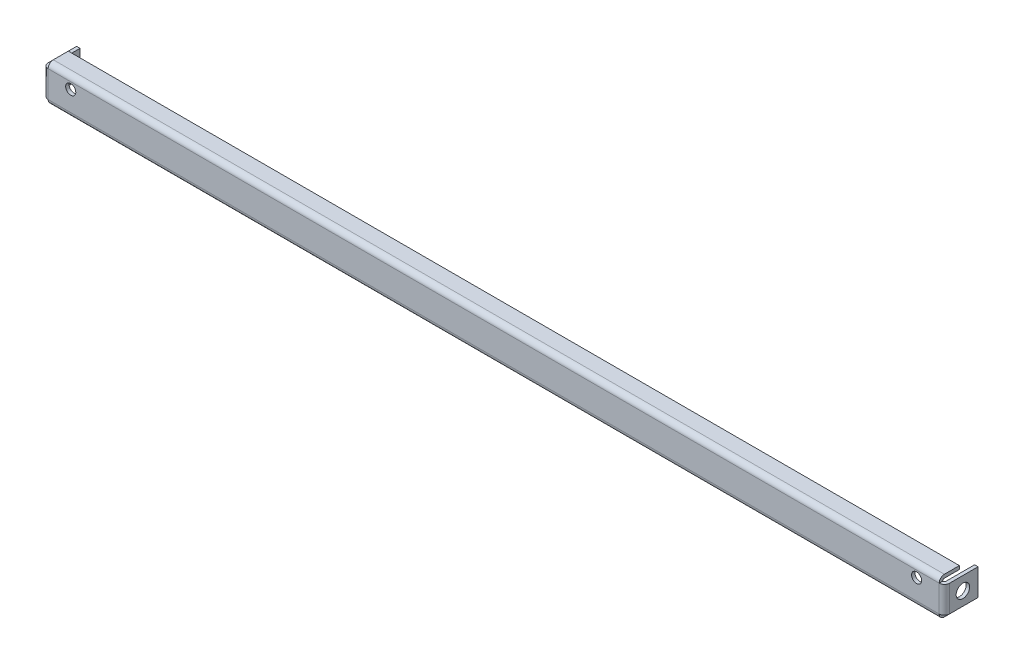
ISO-10303-21;
HEADER;
FILE_DESCRIPTION(('STEP AP214'),'2;1');
FILE_NAME('part.step','',(''),(''),'','','');
FILE_SCHEMA(('AUTOMOTIVE_DESIGN { 1 0 10303 214 1 1 1 1 }'));
ENDSEC;
DATA;
#1=APPLICATION_CONTEXT('core data for automotive mechanical design processes');
#2=APPLICATION_PROTOCOL_DEFINITION('international standard','automotive_design',2000,#1);
#3=PRODUCT_CONTEXT('',#1,'mechanical');
#4=PRODUCT('Part','Part','',(#3));
#5=PRODUCT_RELATED_PRODUCT_CATEGORY('part','',(#4));
#6=PRODUCT_DEFINITION_FORMATION('','',#4);
#7=PRODUCT_DEFINITION_CONTEXT('part definition',#1,'design');
#8=PRODUCT_DEFINITION('design','',#6,#7);
#9=PRODUCT_DEFINITION_SHAPE('','',#8);
#10=(LENGTH_UNIT() NAMED_UNIT(*) SI_UNIT(.MILLI.,.METRE.));
#11=(NAMED_UNIT(*) PLANE_ANGLE_UNIT() SI_UNIT($,.RADIAN.));
#12=(NAMED_UNIT(*) SI_UNIT($,.STERADIAN.) SOLID_ANGLE_UNIT());
#13=UNCERTAINTY_MEASURE_WITH_UNIT(LENGTH_MEASURE(1.E-05),#10,'distance_accuracy_value','');
#14=(GEOMETRIC_REPRESENTATION_CONTEXT(3) GLOBAL_UNCERTAINTY_ASSIGNED_CONTEXT((#13)) GLOBAL_UNIT_ASSIGNED_CONTEXT((#10,
#11,#12)) REPRESENTATION_CONTEXT('',''));
#15=CARTESIAN_POINT('',(0.,0.,0.));
#16=DIRECTION('',(0.,0.,1.));
#17=DIRECTION('',(1.,0.,0.));
#18=AXIS2_PLACEMENT_3D('',#15,#16,#17);
#19=CARTESIAN_POINT('',(212.725,-6.29285,-15.875));
#20=DIRECTION('',(0.,0.,1.));
#21=DIRECTION('',(1.,0.,0.));
#22=AXIS2_PLACEMENT_3D('',#19,#20,#21);
#23=PLANE('',#22);
#24=DIRECTION('',(1.,0.,0.));
#25=VECTOR('',#24,1.);
#26=CARTESIAN_POINT('',(212.725,6.29285,-15.875));
#27=LINE('',#26,#25);
#28=CARTESIAN_POINT('',(212.725,6.29285,-15.875));
#29=VERTEX_POINT('',#28);
#30=CARTESIAN_POINT('',(211.0994,6.29285,-15.875));
#31=VERTEX_POINT('',#30);
#32=EDGE_CURVE('E274',#29,#31,#27,.F.);
#33=ORIENTED_EDGE('',*,*,#32,.F.);
#34=DIRECTION('',(0.,1.,0.));
#35=VECTOR('',#34,1.);
#36=CARTESIAN_POINT('',(212.725,6.29285,-15.875));
#37=LINE('',#36,#35);
#38=CARTESIAN_POINT('',(212.725,-6.29285,-15.875));
#39=VERTEX_POINT('',#38);
#40=EDGE_CURVE('E225',#39,#29,#37,.T.);
#41=ORIENTED_EDGE('',*,*,#40,.F.);
#42=DIRECTION('',(1.,0.,0.));
#43=VECTOR('',#42,1.);
#44=CARTESIAN_POINT('',(212.725,-6.29285,-15.875));
#45=LINE('',#44,#43);
#46=CARTESIAN_POINT('',(211.0994,-6.29285,-15.875));
#47=VERTEX_POINT('',#46);
#48=EDGE_CURVE('E265',#39,#47,#45,.F.);
#49=ORIENTED_EDGE('',*,*,#48,.T.);
#50=DIRECTION('',(0.,1.,0.));
#51=VECTOR('',#50,1.);
#52=CARTESIAN_POINT('',(211.0994,6.29285,-15.875));
#53=LINE('',#52,#51);
#54=EDGE_CURVE('E121',#47,#31,#53,.T.);
#55=ORIENTED_EDGE('',*,*,#54,.T.);
#56=EDGE_LOOP('',(#33,#41,#49,#55));
#57=FACE_BOUND('',#56,.T.);
#58=ADVANCED_FACE('F16',(#57),#23,.F.);
#59=CARTESIAN_POINT('',(-213.37904484263,0.,-8.7376));
#60=DIRECTION('',(-1.,0.,0.));
#61=DIRECTION('',(0.,0.,1.));
#62=AXIS2_PLACEMENT_3D('',#59,#60,#61);
#63=CYLINDRICAL_SURFACE('',#62,3.175);
#64=CARTESIAN_POINT('',(212.725,0.,-8.73760000000003));
#65=DIRECTION('',(-1.,0.,0.));
#66=DIRECTION('',(0.,0.,1.));
#67=AXIS2_PLACEMENT_3D('',#64,#65,#66);
#68=CIRCLE('',#67,3.175);
#69=CARTESIAN_POINT('',(212.725,0.,-5.56260000000003));
#70=VERTEX_POINT('',#69);
#71=EDGE_CURVE('E222',#70,#70,#68,.T.);
#72=ORIENTED_EDGE('',*,*,#71,.F.);
#73=EDGE_LOOP('',(#72));
#74=FACE_BOUND('',#73,.T.);
#75=CARTESIAN_POINT('',(211.0994,0.,-8.73760000000003));
#76=DIRECTION('',(-1.,0.,0.));
#77=DIRECTION('',(0.,0.,1.));
#78=AXIS2_PLACEMENT_3D('',#75,#76,#77);
#79=CIRCLE('',#78,3.175);
#80=CARTESIAN_POINT('',(211.0994,0.,-5.56260000000003));
#81=VERTEX_POINT('',#80);
#82=EDGE_CURVE('E19',#81,#81,#79,.T.);
#83=ORIENTED_EDGE('',*,*,#82,.T.);
#84=EDGE_LOOP('',(#83));
#85=FACE_BOUND('',#84,.T.);
#86=ADVANCED_FACE('F527',(#74,#85),#63,.F.);
#87=CARTESIAN_POINT('',(211.0994,6.29285,-1.38393774617543));
#88=DIRECTION('',(1.,0.,0.));
#89=DIRECTION('',(0.,0.,-1.));
#90=AXIS2_PLACEMENT_3D('',#87,#88,#89);
#91=PLANE('',#90);
#92=ORIENTED_EDGE('',*,*,#82,.F.);
#93=EDGE_LOOP('',(#92));
#94=FACE_BOUND('',#93,.T.);
#95=DIRECTION('',(0.,0.,-1.));
#96=VECTOR('',#95,1.);
#97=CARTESIAN_POINT('',(211.0994,6.29285,-1.38393774617543));
#98=LINE('',#97,#96);
#99=CARTESIAN_POINT('',(211.0994,6.29285,-2.4384));
#100=VERTEX_POINT('',#99);
#101=EDGE_CURVE('E220',#100,#31,#98,.T.);
#102=ORIENTED_EDGE('',*,*,#101,.T.);
#103=ORIENTED_EDGE('',*,*,#54,.F.);
#104=DIRECTION('',(0.,0.,1.));
#105=VECTOR('',#104,1.);
#106=CARTESIAN_POINT('',(211.0994,-6.29285,-1.38393774617543));
#107=LINE('',#106,#105);
#108=CARTESIAN_POINT('',(211.0994,-6.29285,-2.4384));
#109=VERTEX_POINT('',#108);
#110=EDGE_CURVE('E229',#47,#109,#107,.T.);
#111=ORIENTED_EDGE('',*,*,#110,.T.);
#112=DIRECTION('',(0.,-1.,0.));
#113=VECTOR('',#112,1.);
#114=CARTESIAN_POINT('',(211.0994,-6.29285,-2.4384));
#115=LINE('',#114,#113);
#116=EDGE_CURVE('E110',#109,#100,#115,.F.);
#117=ORIENTED_EDGE('',*,*,#116,.T.);
#118=EDGE_LOOP('',(#102,#103,#111,#117));
#119=FACE_BOUND('',#118,.T.);
#120=ADVANCED_FACE('F525',(#94,#119),#91,.F.);
#121=CARTESIAN_POINT('',(-212.725,-8.73125,-9.525));
#122=DIRECTION('',(0.,0.,1.));
#123=DIRECTION('',(0.,-1.,0.));
#124=AXIS2_PLACEMENT_3D('',#121,#122,#123);
#125=PLANE('',#124);
#126=DIRECTION('',(1.,0.,0.));
#127=VECTOR('',#126,1.);
#128=CARTESIAN_POINT('',(-212.725,-7.10565,-9.525));
#129=LINE('',#128,#127);
#130=CARTESIAN_POINT('',(210.2866,-7.10565,-9.525));
#131=VERTEX_POINT('',#130);
#132=CARTESIAN_POINT('',(-210.2866,-7.10565,-9.525));
#133=VERTEX_POINT('',#132);
#134=EDGE_CURVE('E240',#131,#133,#129,.F.);
#135=ORIENTED_EDGE('',*,*,#134,.F.);
#136=DIRECTION('',(0.,-1.,0.));
#137=VECTOR('',#136,1.);
#138=CARTESIAN_POINT('',(210.2866,-8.73125,-9.525));
#139=LINE('',#138,#137);
#140=CARTESIAN_POINT('',(210.2866,-8.73125,-9.525));
#141=VERTEX_POINT('',#140);
#142=EDGE_CURVE('E244',#141,#131,#139,.F.);
#143=ORIENTED_EDGE('',*,*,#142,.F.);
#144=DIRECTION('',(1.,0.,0.));
#145=VECTOR('',#144,1.);
#146=CARTESIAN_POINT('',(-212.725,-8.73125,-9.525));
#147=LINE('',#146,#145);
#148=CARTESIAN_POINT('',(-210.2866,-8.73125,-9.525));
#149=VERTEX_POINT('',#148);
#150=EDGE_CURVE('E216',#141,#149,#147,.F.);
#151=ORIENTED_EDGE('',*,*,#150,.T.);
#152=DIRECTION('',(0.,1.,0.));
#153=VECTOR('',#152,1.);
#154=CARTESIAN_POINT('',(-210.2866,-6.29285,-9.525));
#155=LINE('',#154,#153);
#156=EDGE_CURVE('E266',#149,#133,#155,.T.);
#157=ORIENTED_EDGE('',*,*,#156,.T.);
#158=EDGE_LOOP('',(#135,#143,#151,#157));
#159=FACE_BOUND('',#158,.T.);
#160=ADVANCED_FACE('F521',(#159),#125,.F.);
#161=CARTESIAN_POINT('',(-199.6186,417.37279484263,-5.5626));
#162=DIRECTION('',(0.,1.,0.));
#163=DIRECTION('',(0.,0.,1.));
#164=AXIS2_PLACEMENT_3D('',#161,#162,#163);
#165=CYLINDRICAL_SURFACE('',#164,2.38125);
#166=CARTESIAN_POINT('',(-199.6186,-7.10565000000002,-5.5626));
#167=DIRECTION('',(0.,1.,0.));
#168=DIRECTION('',(0.,0.,1.));
#169=AXIS2_PLACEMENT_3D('',#166,#167,#168);
#170=CIRCLE('',#169,2.38125);
#171=CARTESIAN_POINT('',(-199.6186,-7.10565000000002,-3.18135));
#172=VERTEX_POINT('',#171);
#173=EDGE_CURVE('E235',#172,#172,#170,.F.);
#174=ORIENTED_EDGE('',*,*,#173,.F.);
#175=EDGE_LOOP('',(#174));
#176=FACE_BOUND('',#175,.T.);
#177=CARTESIAN_POINT('',(-199.6186,-8.73125000000002,-5.5626));
#178=DIRECTION('',(0.,1.,0.));
#179=DIRECTION('',(0.,0.,1.));
#180=AXIS2_PLACEMENT_3D('',#177,#178,#179);
#181=CIRCLE('',#180,2.38125);
#182=CARTESIAN_POINT('',(-199.6186,-8.73125000000002,-3.18135));
#183=VERTEX_POINT('',#182);
#184=EDGE_CURVE('E210',#183,#183,#181,.F.);
#185=ORIENTED_EDGE('',*,*,#184,.T.);
#186=EDGE_LOOP('',(#185));
#187=FACE_BOUND('',#186,.T.);
#188=ADVANCED_FACE('F514',(#176,#187),#165,.F.);
#189=CARTESIAN_POINT('',(199.6186,417.37279484263,-5.5626));
#190=DIRECTION('',(0.,1.,0.));
#191=DIRECTION('',(0.,0.,1.));
#192=AXIS2_PLACEMENT_3D('',#189,#190,#191);
#193=CYLINDRICAL_SURFACE('',#192,2.38125);
#194=CARTESIAN_POINT('',(199.6186,-7.10565000000002,-5.5626));
#195=DIRECTION('',(0.,1.,0.));
#196=DIRECTION('',(0.,0.,1.));
#197=AXIS2_PLACEMENT_3D('',#194,#195,#196);
#198=CIRCLE('',#197,2.38125);
#199=CARTESIAN_POINT('',(199.6186,-7.10565000000002,-3.18135));
#200=VERTEX_POINT('',#199);
#201=EDGE_CURVE('E238',#200,#200,#198,.F.);
#202=ORIENTED_EDGE('',*,*,#201,.F.);
#203=EDGE_LOOP('',(#202));
#204=FACE_BOUND('',#203,.T.);
#205=CARTESIAN_POINT('',(199.6186,-8.73125000000002,-5.5626));
#206=DIRECTION('',(0.,1.,0.));
#207=DIRECTION('',(0.,0.,1.));
#208=AXIS2_PLACEMENT_3D('',#205,#206,#207);
#209=CIRCLE('',#208,2.38125);
#210=CARTESIAN_POINT('',(199.6186,-8.73125000000002,-3.18135));
#211=VERTEX_POINT('',#210);
#212=EDGE_CURVE('E207',#211,#211,#209,.F.);
#213=ORIENTED_EDGE('',*,*,#212,.T.);
#214=EDGE_LOOP('',(#213));
#215=FACE_BOUND('',#214,.T.);
#216=ADVANCED_FACE('F504',(#204,#215),#193,.F.);
#217=CARTESIAN_POINT('',(-212.725,-7.10565,0.));
#218=DIRECTION('',(0.,1.,0.));
#219=DIRECTION('',(0.,0.,1.));
#220=AXIS2_PLACEMENT_3D('',#217,#218,#219);
#221=PLANE('',#220);
#222=ORIENTED_EDGE('',*,*,#173,.T.);
#223=EDGE_LOOP('',(#222));
#224=FACE_BOUND('',#223,.T.);
#225=ORIENTED_EDGE('',*,*,#201,.T.);
#226=EDGE_LOOP('',(#225));
#227=FACE_BOUND('',#226,.T.);
#228=DIRECTION('',(0.,0.,-1.));
#229=VECTOR('',#228,1.);
#230=CARTESIAN_POINT('',(210.2866,-7.10565,-2.4384));
#231=LINE('',#230,#229);
#232=CARTESIAN_POINT('',(210.2866,-7.10565,-2.4384));
#233=VERTEX_POINT('',#232);
#234=EDGE_CURVE('E345',#131,#233,#231,.F.);
#235=ORIENTED_EDGE('',*,*,#234,.F.);
#236=ORIENTED_EDGE('',*,*,#134,.T.);
#237=DIRECTION('',(0.,0.,-1.));
#238=VECTOR('',#237,1.);
#239=CARTESIAN_POINT('',(-210.2866,-7.10565,-2.4384));
#240=LINE('',#239,#238);
#241=CARTESIAN_POINT('',(-210.2866,-7.10565,-2.4384));
#242=VERTEX_POINT('',#241);
#243=EDGE_CURVE('E217',#133,#242,#240,.F.);
#244=ORIENTED_EDGE('',*,*,#243,.T.);
#245=DIRECTION('',(-1.,0.,0.));
#246=VECTOR('',#245,1.);
#247=CARTESIAN_POINT('',(-212.725,-7.10565,-2.4384));
#248=LINE('',#247,#246);
#249=EDGE_CURVE('E263',#242,#233,#248,.F.);
#250=ORIENTED_EDGE('',*,*,#249,.T.);
#251=EDGE_LOOP('',(#235,#236,#244,#250));
#252=FACE_BOUND('',#251,.T.);
#253=ADVANCED_FACE('F502',(#224,#227,#252),#221,.T.);
#254=CARTESIAN_POINT('',(-212.725,6.29285,-15.875));
#255=DIRECTION('',(0.,0.,1.));
#256=DIRECTION('',(1.,0.,0.));
#257=AXIS2_PLACEMENT_3D('',#254,#255,#256);
#258=PLANE('',#257);
#259=DIRECTION('',(1.,0.,0.));
#260=VECTOR('',#259,1.);
#261=CARTESIAN_POINT('',(-212.725,-6.29285,-15.875));
#262=LINE('',#261,#260);
#263=CARTESIAN_POINT('',(-212.725,-6.29285,-15.875));
#264=VERTEX_POINT('',#263);
#265=CARTESIAN_POINT('',(-211.0994,-6.29285,-15.875));
#266=VERTEX_POINT('',#265);
#267=EDGE_CURVE('E237',#264,#266,#262,.T.);
#268=ORIENTED_EDGE('',*,*,#267,.F.);
#269=DIRECTION('',(0.,1.,0.));
#270=VECTOR('',#269,1.);
#271=CARTESIAN_POINT('',(-212.725,6.29285,-15.875));
#272=LINE('',#271,#270);
#273=CARTESIAN_POINT('',(-212.725,6.29285,-15.875));
#274=VERTEX_POINT('',#273);
#275=EDGE_CURVE('E201',#264,#274,#272,.T.);
#276=ORIENTED_EDGE('',*,*,#275,.T.);
#277=DIRECTION('',(1.,0.,0.));
#278=VECTOR('',#277,1.);
#279=CARTESIAN_POINT('',(-212.725,6.29285,-15.875));
#280=LINE('',#279,#278);
#281=CARTESIAN_POINT('',(-211.0994,6.29285,-15.875));
#282=VERTEX_POINT('',#281);
#283=EDGE_CURVE('E342',#274,#282,#280,.T.);
#284=ORIENTED_EDGE('',*,*,#283,.T.);
#285=DIRECTION('',(0.,1.,0.));
#286=VECTOR('',#285,1.);
#287=CARTESIAN_POINT('',(-211.0994,6.29285,-15.875));
#288=LINE('',#287,#286);
#289=EDGE_CURVE('E234',#266,#282,#288,.T.);
#290=ORIENTED_EDGE('',*,*,#289,.F.);
#291=EDGE_LOOP('',(#268,#276,#284,#290));
#292=FACE_BOUND('',#291,.T.);
#293=ADVANCED_FACE('F437',(#292),#258,.F.);
#294=CARTESIAN_POINT('',(213.37904484263,0.,-8.7376));
#295=DIRECTION('',(1.,0.,0.));
#296=DIRECTION('',(0.,0.,-1.));
#297=AXIS2_PLACEMENT_3D('',#294,#295,#296);
#298=CYLINDRICAL_SURFACE('',#297,3.175);
#299=CARTESIAN_POINT('',(-211.0994,0.,-8.73760000000003));
#300=DIRECTION('',(1.,0.,0.));
#301=DIRECTION('',(0.,0.,-1.));
#302=AXIS2_PLACEMENT_3D('',#299,#300,#301);
#303=CIRCLE('',#302,3.175);
#304=CARTESIAN_POINT('',(-211.0994,0.,-11.9126));
#305=VERTEX_POINT('',#304);
#306=EDGE_CURVE('E230',#305,#305,#303,.F.);
#307=ORIENTED_EDGE('',*,*,#306,.F.);
#308=EDGE_LOOP('',(#307));
#309=FACE_BOUND('',#308,.T.);
#310=CARTESIAN_POINT('',(-212.725,0.,-8.73760000000003));
#311=DIRECTION('',(1.,0.,0.));
#312=DIRECTION('',(0.,0.,-1.));
#313=AXIS2_PLACEMENT_3D('',#310,#311,#312);
#314=CIRCLE('',#313,3.175);
#315=CARTESIAN_POINT('',(-212.725,0.,-11.9126));
#316=VERTEX_POINT('',#315);
#317=EDGE_CURVE('E194',#316,#316,#314,.F.);
#318=ORIENTED_EDGE('',*,*,#317,.T.);
#319=EDGE_LOOP('',(#318));
#320=FACE_BOUND('',#319,.T.);
#321=ADVANCED_FACE('F512',(#309,#320),#298,.F.);
#322=CARTESIAN_POINT('',(-211.0994,6.29285,-1.38393774617543));
#323=DIRECTION('',(1.,0.,0.));
#324=DIRECTION('',(0.,0.,-1.));
#325=AXIS2_PLACEMENT_3D('',#322,#323,#324);
#326=PLANE('',#325);
#327=ORIENTED_EDGE('',*,*,#306,.T.);
#328=EDGE_LOOP('',(#327));
#329=FACE_BOUND('',#328,.T.);
#330=DIRECTION('',(0.,0.,1.));
#331=VECTOR('',#330,1.);
#332=CARTESIAN_POINT('',(-211.0994,-6.29285,-15.875));
#333=LINE('',#332,#331);
#334=CARTESIAN_POINT('',(-211.0994,-6.29285,-2.4384));
#335=VERTEX_POINT('',#334);
#336=EDGE_CURVE('E192',#335,#266,#333,.F.);
#337=ORIENTED_EDGE('',*,*,#336,.T.);
#338=ORIENTED_EDGE('',*,*,#289,.T.);
#339=DIRECTION('',(0.,0.,-1.));
#340=VECTOR('',#339,1.);
#341=CARTESIAN_POINT('',(-211.0994,6.29285,-1.38393774617543));
#342=LINE('',#341,#340);
#343=CARTESIAN_POINT('',(-211.0994,6.29285,-2.4384));
#344=VERTEX_POINT('',#343);
#345=EDGE_CURVE('E202',#282,#344,#342,.F.);
#346=ORIENTED_EDGE('',*,*,#345,.T.);
#347=DIRECTION('',(0.,1.,0.));
#348=VECTOR('',#347,1.);
#349=CARTESIAN_POINT('',(-211.0994,6.29285,-2.4384));
#350=LINE('',#349,#348);
#351=EDGE_CURVE('E384',#344,#335,#350,.F.);
#352=ORIENTED_EDGE('',*,*,#351,.T.);
#353=EDGE_LOOP('',(#337,#338,#346,#352));
#354=FACE_BOUND('',#353,.T.);
#355=ADVANCED_FACE('F441',(#329,#354),#326,.T.);
#356=CARTESIAN_POINT('',(-212.725,8.73125,-9.525));
#357=DIRECTION('',(0.,0.,-1.));
#358=DIRECTION('',(0.,1.,0.));
#359=AXIS2_PLACEMENT_3D('',#356,#357,#358);
#360=PLANE('',#359);
#361=DIRECTION('',(0.,1.,0.));
#362=VECTOR('',#361,1.);
#363=CARTESIAN_POINT('',(210.2866,8.73125,-9.525));
#364=LINE('',#363,#362);
#365=CARTESIAN_POINT('',(210.2866,8.73125,-9.525));
#366=VERTEX_POINT('',#365);
#367=CARTESIAN_POINT('',(210.2866,7.10565,-9.525));
#368=VERTEX_POINT('',#367);
#369=EDGE_CURVE('E385',#366,#368,#364,.F.);
#370=ORIENTED_EDGE('',*,*,#369,.T.);
#371=DIRECTION('',(1.,0.,0.));
#372=VECTOR('',#371,1.);
#373=CARTESIAN_POINT('',(-212.725,7.10565,-9.525));
#374=LINE('',#373,#372);
#375=CARTESIAN_POINT('',(-210.2866,7.10565,-9.525));
#376=VERTEX_POINT('',#375);
#377=EDGE_CURVE('E381',#376,#368,#374,.T.);
#378=ORIENTED_EDGE('',*,*,#377,.F.);
#379=DIRECTION('',(0.,1.,0.));
#380=VECTOR('',#379,1.);
#381=CARTESIAN_POINT('',(-210.2866,8.73125,-9.525));
#382=LINE('',#381,#380);
#383=CARTESIAN_POINT('',(-210.2866,8.73125,-9.525));
#384=VERTEX_POINT('',#383);
#385=EDGE_CURVE('E233',#376,#384,#382,.T.);
#386=ORIENTED_EDGE('',*,*,#385,.T.);
#387=DIRECTION('',(1.,0.,0.));
#388=VECTOR('',#387,1.);
#389=CARTESIAN_POINT('',(-212.725,8.73125,-9.525));
#390=LINE('',#389,#388);
#391=EDGE_CURVE('E154',#384,#366,#390,.T.);
#392=ORIENTED_EDGE('',*,*,#391,.T.);
#393=EDGE_LOOP('',(#370,#378,#386,#392));
#394=FACE_BOUND('',#393,.T.);
#395=ADVANCED_FACE('F561',(#394),#360,.T.);
#396=CARTESIAN_POINT('',(-212.725,7.10565,0.));
#397=DIRECTION('',(0.,-1.,0.));
#398=DIRECTION('',(0.,0.,-1.));
#399=AXIS2_PLACEMENT_3D('',#396,#397,#398);
#400=PLANE('',#399);
#401=DIRECTION('',(0.,0.,-1.));
#402=VECTOR('',#401,1.);
#403=CARTESIAN_POINT('',(210.2866,7.10565,-2.4384));
#404=LINE('',#403,#402);
#405=CARTESIAN_POINT('',(210.2866,7.10565,-2.4384));
#406=VERTEX_POINT('',#405);
#407=EDGE_CURVE('E184',#406,#368,#404,.T.);
#408=ORIENTED_EDGE('',*,*,#407,.F.);
#409=DIRECTION('',(-1.,0.,0.));
#410=VECTOR('',#409,1.);
#411=CARTESIAN_POINT('',(-212.725,7.10565,-2.4384));
#412=LINE('',#411,#410);
#413=CARTESIAN_POINT('',(-210.2866,7.10565,-2.4384));
#414=VERTEX_POINT('',#413);
#415=EDGE_CURVE('E278',#406,#414,#412,.T.);
#416=ORIENTED_EDGE('',*,*,#415,.T.);
#417=DIRECTION('',(0.,0.,-1.));
#418=VECTOR('',#417,1.);
#419=CARTESIAN_POINT('',(-210.2866,7.10565,-2.4384));
#420=LINE('',#419,#418);
#421=EDGE_CURVE('E156',#414,#376,#420,.T.);
#422=ORIENTED_EDGE('',*,*,#421,.T.);
#423=ORIENTED_EDGE('',*,*,#377,.T.);
#424=EDGE_LOOP('',(#408,#416,#422,#423));
#425=FACE_BOUND('',#424,.T.);
#426=ADVANCED_FACE('F558',(#425),#400,.T.);
#427=CARTESIAN_POINT('',(-210.2866,6.29285,-2.4384));
#428=DIRECTION('',(0.,1.,0.));
#429=DIRECTION('',(0.,0.,1.));
#430=AXIS2_PLACEMENT_3D('',#427,#428,#429);
#431=CYLINDRICAL_SURFACE('',#430,0.8128);
#432=CARTESIAN_POINT('',(-210.2866,-6.29285,-2.4384));
#433=DIRECTION('',(0.,1.,0.));
#434=DIRECTION('',(0.,0.,1.));
#435=AXIS2_PLACEMENT_3D('',#432,#433,#434);
#436=CIRCLE('',#435,0.8128);
#437=CARTESIAN_POINT('',(-210.2866,-6.29285,-1.6256));
#438=VERTEX_POINT('',#437);
#439=EDGE_CURVE('E189',#438,#335,#436,.F.);
#440=ORIENTED_EDGE('',*,*,#439,.T.);
#441=ORIENTED_EDGE('',*,*,#351,.F.);
#442=CARTESIAN_POINT('',(-210.2866,6.29285,-2.4384));
#443=DIRECTION('',(0.,1.,0.));
#444=DIRECTION('',(0.,0.,1.));
#445=AXIS2_PLACEMENT_3D('',#442,#443,#444);
#446=CIRCLE('',#445,0.8128);
#447=CARTESIAN_POINT('',(-210.2866,6.29285,-1.6256));
#448=VERTEX_POINT('',#447);
#449=EDGE_CURVE('E199',#344,#448,#446,.T.);
#450=ORIENTED_EDGE('',*,*,#449,.T.);
#451=DIRECTION('',(0.,1.,0.));
#452=VECTOR('',#451,1.);
#453=CARTESIAN_POINT('',(-210.2866,8.73125,-1.6256));
#454=LINE('',#453,#452);
#455=EDGE_CURVE('E392',#438,#448,#454,.T.);
#456=ORIENTED_EDGE('',*,*,#455,.F.);
#457=EDGE_LOOP('',(#440,#441,#450,#456));
#458=FACE_BOUND('',#457,.T.);
#459=ADVANCED_FACE('F492',(#458),#431,.F.);
#460=CARTESIAN_POINT('',(-212.725,6.29285,-2.4384));
#461=DIRECTION('',(-1.,0.,0.));
#462=DIRECTION('',(0.,0.,1.));
#463=AXIS2_PLACEMENT_3D('',#460,#461,#462);
#464=CYLINDRICAL_SURFACE('',#463,0.8128);
#465=ORIENTED_EDGE('',*,*,#415,.F.);
#466=CARTESIAN_POINT('',(210.2866,6.29285,-2.4384));
#467=DIRECTION('',(-1.,0.,0.));
#468=DIRECTION('',(0.,0.,1.));
#469=AXIS2_PLACEMENT_3D('',#466,#467,#468);
#470=CIRCLE('',#469,0.8128);
#471=CARTESIAN_POINT('',(210.2866,6.29285,-1.6256));
#472=VERTEX_POINT('',#471);
#473=EDGE_CURVE('E181',#472,#406,#470,.T.);
#474=ORIENTED_EDGE('',*,*,#473,.F.);
#475=DIRECTION('',(-1.,0.,0.));
#476=VECTOR('',#475,1.);
#477=CARTESIAN_POINT('',(-212.725,6.29285,-1.6256));
#478=LINE('',#477,#476);
#479=EDGE_CURVE('E388',#448,#472,#478,.F.);
#480=ORIENTED_EDGE('',*,*,#479,.F.);
#481=CARTESIAN_POINT('',(-210.2866,6.29285,-2.4384));
#482=DIRECTION('',(-1.,0.,0.));
#483=DIRECTION('',(0.,0.,1.));
#484=AXIS2_PLACEMENT_3D('',#481,#482,#483);
#485=CIRCLE('',#484,0.8128);
#486=EDGE_CURVE('E186',#448,#414,#485,.T.);
#487=ORIENTED_EDGE('',*,*,#486,.T.);
#488=EDGE_LOOP('',(#465,#474,#480,#487));
#489=FACE_BOUND('',#488,.T.);
#490=ADVANCED_FACE('F497',(#489),#464,.F.);
#491=CARTESIAN_POINT('',(210.2866,-6.29285,-2.4384));
#492=DIRECTION('',(0.,-1.,0.));
#493=DIRECTION('',(0.,0.,-1.));
#494=AXIS2_PLACEMENT_3D('',#491,#492,#493);
#495=CYLINDRICAL_SURFACE('',#494,0.8128);
#496=CARTESIAN_POINT('',(210.2866,6.29285,-2.4384));
#497=DIRECTION('',(0.,-1.,0.));
#498=DIRECTION('',(0.,0.,-1.));
#499=AXIS2_PLACEMENT_3D('',#496,#497,#498);
#500=CIRCLE('',#499,0.8128);
#501=EDGE_CURVE('E218',#472,#100,#500,.F.);
#502=ORIENTED_EDGE('',*,*,#501,.T.);
#503=ORIENTED_EDGE('',*,*,#116,.F.);
#504=CARTESIAN_POINT('',(210.2866,-6.29285,-2.4384));
#505=DIRECTION('',(0.,-1.,0.));
#506=DIRECTION('',(0.,0.,-1.));
#507=AXIS2_PLACEMENT_3D('',#504,#505,#506);
#508=CIRCLE('',#507,0.8128);
#509=CARTESIAN_POINT('',(210.2866,-6.29285,-1.6256));
#510=VERTEX_POINT('',#509);
#511=EDGE_CURVE('E226',#109,#510,#508,.T.);
#512=ORIENTED_EDGE('',*,*,#511,.T.);
#513=DIRECTION('',(0.,1.,0.));
#514=VECTOR('',#513,1.);
#515=CARTESIAN_POINT('',(210.2866,8.73125,-1.6256));
#516=LINE('',#515,#514);
#517=EDGE_CURVE('E391',#472,#510,#516,.F.);
#518=ORIENTED_EDGE('',*,*,#517,.F.);
#519=EDGE_LOOP('',(#502,#503,#512,#518));
#520=FACE_BOUND('',#519,.T.);
#521=ADVANCED_FACE('F545',(#520),#495,.F.);
#522=CARTESIAN_POINT('',(-212.725,-6.29285,-2.4384));
#523=DIRECTION('',(-1.,0.,0.));
#524=DIRECTION('',(0.,0.,1.));
#525=AXIS2_PLACEMENT_3D('',#522,#523,#524);
#526=CYLINDRICAL_SURFACE('',#525,0.8128);
#527=DIRECTION('',(-1.,0.,0.));
#528=VECTOR('',#527,1.);
#529=CARTESIAN_POINT('',(-212.725,-6.29285,-1.6256));
#530=LINE('',#529,#528);
#531=EDGE_CURVE('E180',#510,#438,#530,.T.);
#532=ORIENTED_EDGE('',*,*,#531,.F.);
#533=CARTESIAN_POINT('',(210.2866,-6.29285,-2.4384));
#534=DIRECTION('',(-1.,0.,0.));
#535=DIRECTION('',(0.,0.,1.));
#536=AXIS2_PLACEMENT_3D('',#533,#534,#535);
#537=CIRCLE('',#536,0.8128);
#538=EDGE_CURVE('E203',#233,#510,#537,.T.);
#539=ORIENTED_EDGE('',*,*,#538,.F.);
#540=ORIENTED_EDGE('',*,*,#249,.F.);
#541=CARTESIAN_POINT('',(-210.2866,-6.29285,-2.4384));
#542=DIRECTION('',(-1.,0.,0.));
#543=DIRECTION('',(0.,0.,1.));
#544=AXIS2_PLACEMENT_3D('',#541,#542,#543);
#545=CIRCLE('',#544,0.8128);
#546=EDGE_CURVE('E214',#242,#438,#545,.T.);
#547=ORIENTED_EDGE('',*,*,#546,.T.);
#548=EDGE_LOOP('',(#532,#539,#540,#547));
#549=FACE_BOUND('',#548,.T.);
#550=ADVANCED_FACE('F501',(#549),#526,.F.);
#551=CARTESIAN_POINT('',(212.725,-6.29285,-1.38393774617543));
#552=DIRECTION('',(0.,1.,0.));
#553=DIRECTION('',(0.,0.,1.));
#554=AXIS2_PLACEMENT_3D('',#551,#552,#553);
#555=PLANE('',#554);
#556=CARTESIAN_POINT('',(210.2866,-6.29285,-2.4384));
#557=DIRECTION('',(0.,-1.,0.));
#558=DIRECTION('',(0.,0.,-1.));
#559=AXIS2_PLACEMENT_3D('',#556,#557,#558);
#560=CIRCLE('',#559,2.4384);
#561=CARTESIAN_POINT('',(210.2866,-6.29285,0.));
#562=VERTEX_POINT('',#561);
#563=CARTESIAN_POINT('',(212.725,-6.29285,-2.4384));
#564=VERTEX_POINT('',#563);
#565=EDGE_CURVE('E178',#562,#564,#560,.F.);
#566=ORIENTED_EDGE('',*,*,#565,.F.);
#567=DIRECTION('',(0.,0.,-1.));
#568=VECTOR('',#567,1.);
#569=CARTESIAN_POINT('',(210.2866,-6.29285,-2.4384));
#570=LINE('',#569,#568);
#571=EDGE_CURVE('E206',#510,#562,#570,.F.);
#572=ORIENTED_EDGE('',*,*,#571,.F.);
#573=ORIENTED_EDGE('',*,*,#511,.F.);
#574=ORIENTED_EDGE('',*,*,#110,.F.);
#575=ORIENTED_EDGE('',*,*,#48,.F.);
#576=DIRECTION('',(0.,0.,-1.));
#577=VECTOR('',#576,1.);
#578=CARTESIAN_POINT('',(212.725,-6.29285,-1.38393774617543));
#579=LINE('',#578,#577);
#580=EDGE_CURVE('E228',#564,#39,#579,.T.);
#581=ORIENTED_EDGE('',*,*,#580,.F.);
#582=EDGE_LOOP('',(#566,#572,#573,#574,#575,#581));
#583=FACE_BOUND('',#582,.T.);
#584=ADVANCED_FACE('F472',(#583),#555,.F.);
#585=CARTESIAN_POINT('',(212.725,6.29285,-1.38393774617543));
#586=DIRECTION('',(1.,0.,0.));
#587=DIRECTION('',(0.,0.,-1.));
#588=AXIS2_PLACEMENT_3D('',#585,#586,#587);
#589=PLANE('',#588);
#590=ORIENTED_EDGE('',*,*,#71,.T.);
#591=EDGE_LOOP('',(#590));
#592=FACE_BOUND('',#591,.T.);
#593=ORIENTED_EDGE('',*,*,#580,.T.);
#594=ORIENTED_EDGE('',*,*,#40,.T.);
#595=DIRECTION('',(0.,0.,-1.));
#596=VECTOR('',#595,1.);
#597=CARTESIAN_POINT('',(212.725,6.29285,-1.38393774617543));
#598=LINE('',#597,#596);
#599=CARTESIAN_POINT('',(212.725,6.29285,-2.4384));
#600=VERTEX_POINT('',#599);
#601=EDGE_CURVE('E221',#29,#600,#598,.F.);
#602=ORIENTED_EDGE('',*,*,#601,.T.);
#603=DIRECTION('',(0.,-1.,0.));
#604=VECTOR('',#603,1.);
#605=CARTESIAN_POINT('',(212.725,-6.29285,-2.4384));
#606=LINE('',#605,#604);
#607=EDGE_CURVE('E177',#564,#600,#606,.F.);
#608=ORIENTED_EDGE('',*,*,#607,.F.);
#609=EDGE_LOOP('',(#593,#594,#602,#608));
#610=FACE_BOUND('',#609,.T.);
#611=ADVANCED_FACE('F595',(#592,#610),#589,.T.);
#612=CARTESIAN_POINT('',(212.725,6.29285,-1.38393774617543));
#613=DIRECTION('',(0.,-1.,0.));
#614=DIRECTION('',(0.,0.,-1.));
#615=AXIS2_PLACEMENT_3D('',#612,#613,#614);
#616=PLANE('',#615);
#617=ORIENTED_EDGE('',*,*,#501,.F.);
#618=DIRECTION('',(0.,0.,-1.));
#619=VECTOR('',#618,1.);
#620=CARTESIAN_POINT('',(210.2866,6.29285,-2.4384));
#621=LINE('',#620,#619);
#622=CARTESIAN_POINT('',(210.2866,6.29285,0.));
#623=VERTEX_POINT('',#622);
#624=EDGE_CURVE('E185',#623,#472,#621,.T.);
#625=ORIENTED_EDGE('',*,*,#624,.F.);
#626=CARTESIAN_POINT('',(210.2866,6.29285,-2.4384));
#627=DIRECTION('',(0.,-1.,0.));
#628=DIRECTION('',(0.,0.,-1.));
#629=AXIS2_PLACEMENT_3D('',#626,#627,#628);
#630=CIRCLE('',#629,2.4384);
#631=EDGE_CURVE('E175',#600,#623,#630,.T.);
#632=ORIENTED_EDGE('',*,*,#631,.F.);
#633=ORIENTED_EDGE('',*,*,#601,.F.);
#634=ORIENTED_EDGE('',*,*,#32,.T.);
#635=ORIENTED_EDGE('',*,*,#101,.F.);
#636=EDGE_LOOP('',(#617,#625,#632,#633,#634,#635));
#637=FACE_BOUND('',#636,.T.);
#638=ADVANCED_FACE('F541',(#637),#616,.F.);
#639=CARTESIAN_POINT('',(-210.2866,-6.29285,-2.4384));
#640=DIRECTION('',(1.,0.,0.));
#641=DIRECTION('',(0.,0.,-1.));
#642=AXIS2_PLACEMENT_3D('',#639,#640,#641);
#643=PLANE('',#642);
#644=ORIENTED_EDGE('',*,*,#546,.F.);
#645=ORIENTED_EDGE('',*,*,#243,.F.);
#646=ORIENTED_EDGE('',*,*,#156,.F.);
#647=DIRECTION('',(0.,0.,1.));
#648=VECTOR('',#647,1.);
#649=CARTESIAN_POINT('',(-210.2866,-8.73125,0.));
#650=LINE('',#649,#648);
#651=CARTESIAN_POINT('',(-210.2866,-8.73125,-2.4384));
#652=VERTEX_POINT('',#651);
#653=EDGE_CURVE('E213',#149,#652,#650,.T.);
#654=ORIENTED_EDGE('',*,*,#653,.T.);
#655=CARTESIAN_POINT('',(-210.2866,-6.29285,-2.4384));
#656=DIRECTION('',(-1.,0.,0.));
#657=DIRECTION('',(0.,0.,1.));
#658=AXIS2_PLACEMENT_3D('',#655,#656,#657);
#659=CIRCLE('',#658,2.4384);
#660=CARTESIAN_POINT('',(-210.2866,-6.29285,0.));
#661=VERTEX_POINT('',#660);
#662=EDGE_CURVE('E173',#661,#652,#659,.F.);
#663=ORIENTED_EDGE('',*,*,#662,.F.);
#664=DIRECTION('',(0.,0.,1.));
#665=VECTOR('',#664,1.);
#666=CARTESIAN_POINT('',(-210.2866,-6.29285,-15.875));
#667=LINE('',#666,#665);
#668=EDGE_CURVE('E193',#661,#438,#667,.F.);
#669=ORIENTED_EDGE('',*,*,#668,.T.);
#670=EDGE_LOOP('',(#644,#645,#646,#654,#663,#669));
#671=FACE_BOUND('',#670,.T.);
#672=ADVANCED_FACE('F458',(#671),#643,.F.);
#673=CARTESIAN_POINT('',(-212.725,-8.73125,0.));
#674=DIRECTION('',(0.,1.,0.));
#675=DIRECTION('',(0.,0.,1.));
#676=AXIS2_PLACEMENT_3D('',#673,#674,#675);
#677=PLANE('',#676);
#678=ORIENTED_EDGE('',*,*,#212,.F.);
#679=EDGE_LOOP('',(#678));
#680=FACE_BOUND('',#679,.T.);
#681=ORIENTED_EDGE('',*,*,#184,.F.);
#682=EDGE_LOOP('',(#681));
#683=FACE_BOUND('',#682,.T.);
#684=ORIENTED_EDGE('',*,*,#653,.F.);
#685=ORIENTED_EDGE('',*,*,#150,.F.);
#686=DIRECTION('',(0.,0.,-1.));
#687=VECTOR('',#686,1.);
#688=CARTESIAN_POINT('',(210.2866,-8.73125,-2.4384));
#689=LINE('',#688,#687);
#690=CARTESIAN_POINT('',(210.2866,-8.73125,-2.4384));
#691=VERTEX_POINT('',#690);
#692=EDGE_CURVE('E348',#691,#141,#689,.T.);
#693=ORIENTED_EDGE('',*,*,#692,.F.);
#694=DIRECTION('',(-1.,0.,0.));
#695=VECTOR('',#694,1.);
#696=CARTESIAN_POINT('',(-212.725,-8.73125,-2.4384));
#697=LINE('',#696,#695);
#698=EDGE_CURVE('E172',#652,#691,#697,.F.);
#699=ORIENTED_EDGE('',*,*,#698,.F.);
#700=EDGE_LOOP('',(#684,#685,#693,#699));
#701=FACE_BOUND('',#700,.T.);
#702=ADVANCED_FACE('F465',(#680,#683,#701),#677,.F.);
#703=CARTESIAN_POINT('',(210.2866,6.29285,-2.4384));
#704=DIRECTION('',(1.,0.,0.));
#705=DIRECTION('',(0.,0.,-1.));
#706=AXIS2_PLACEMENT_3D('',#703,#704,#705);
#707=PLANE('',#706);
#708=ORIENTED_EDGE('',*,*,#142,.T.);
#709=ORIENTED_EDGE('',*,*,#234,.T.);
#710=ORIENTED_EDGE('',*,*,#538,.T.);
#711=ORIENTED_EDGE('',*,*,#571,.T.);
#712=CARTESIAN_POINT('',(210.2866,-6.29285,-2.4384));
#713=DIRECTION('',(-1.,0.,0.));
#714=DIRECTION('',(0.,0.,1.));
#715=AXIS2_PLACEMENT_3D('',#712,#713,#714);
#716=CIRCLE('',#715,2.4384);
#717=EDGE_CURVE('E169',#691,#562,#716,.T.);
#718=ORIENTED_EDGE('',*,*,#717,.F.);
#719=ORIENTED_EDGE('',*,*,#692,.T.);
#720=EDGE_LOOP('',(#708,#709,#710,#711,#718,#719));
#721=FACE_BOUND('',#720,.T.);
#722=ADVANCED_FACE('F467',(#721),#707,.T.);
#723=CARTESIAN_POINT('',(-212.725,6.29285,-1.38393774617543));
#724=DIRECTION('',(0.,-1.,0.));
#725=DIRECTION('',(0.,0.,-1.));
#726=AXIS2_PLACEMENT_3D('',#723,#724,#725);
#727=PLANE('',#726);
#728=CARTESIAN_POINT('',(-210.2866,6.29285,-2.4384));
#729=DIRECTION('',(0.,1.,0.));
#730=DIRECTION('',(0.,0.,1.));
#731=AXIS2_PLACEMENT_3D('',#728,#729,#730);
#732=CIRCLE('',#731,2.4384);
#733=CARTESIAN_POINT('',(-210.2866,6.29285,0.));
#734=VERTEX_POINT('',#733);
#735=CARTESIAN_POINT('',(-212.725,6.29285,-2.4384));
#736=VERTEX_POINT('',#735);
#737=EDGE_CURVE('E167',#734,#736,#732,.F.);
#738=ORIENTED_EDGE('',*,*,#737,.F.);
#739=DIRECTION('',(0.,0.,-1.));
#740=VECTOR('',#739,1.);
#741=CARTESIAN_POINT('',(-210.2866,6.29285,-2.4384));
#742=LINE('',#741,#740);
#743=EDGE_CURVE('E34',#734,#448,#742,.T.);
#744=ORIENTED_EDGE('',*,*,#743,.T.);
#745=ORIENTED_EDGE('',*,*,#449,.F.);
#746=ORIENTED_EDGE('',*,*,#345,.F.);
#747=ORIENTED_EDGE('',*,*,#283,.F.);
#748=DIRECTION('',(0.,0.,-1.));
#749=VECTOR('',#748,1.);
#750=CARTESIAN_POINT('',(-212.725,6.29285,-1.38393774617543));
#751=LINE('',#750,#749);
#752=EDGE_CURVE('E198',#274,#736,#751,.F.);
#753=ORIENTED_EDGE('',*,*,#752,.T.);
#754=EDGE_LOOP('',(#738,#744,#745,#746,#747,#753));
#755=FACE_BOUND('',#754,.T.);
#756=ADVANCED_FACE('F488',(#755),#727,.F.);
#757=CARTESIAN_POINT('',(-212.725,6.29285,-1.38393774617543));
#758=DIRECTION('',(1.,0.,0.));
#759=DIRECTION('',(0.,0.,-1.));
#760=AXIS2_PLACEMENT_3D('',#757,#758,#759);
#761=PLANE('',#760);
#762=ORIENTED_EDGE('',*,*,#317,.F.);
#763=EDGE_LOOP('',(#762));
#764=FACE_BOUND('',#763,.T.);
#765=ORIENTED_EDGE('',*,*,#752,.F.);
#766=ORIENTED_EDGE('',*,*,#275,.F.);
#767=DIRECTION('',(0.,0.,1.));
#768=VECTOR('',#767,1.);
#769=CARTESIAN_POINT('',(-212.725,-6.29285,-15.875));
#770=LINE('',#769,#768);
#771=CARTESIAN_POINT('',(-212.725,-6.29285,-2.4384));
#772=VERTEX_POINT('',#771);
#773=EDGE_CURVE('E197',#264,#772,#770,.T.);
#774=ORIENTED_EDGE('',*,*,#773,.T.);
#775=DIRECTION('',(0.,1.,0.));
#776=VECTOR('',#775,1.);
#777=CARTESIAN_POINT('',(-212.725,6.29285,-2.4384));
#778=LINE('',#777,#776);
#779=EDGE_CURVE('E166',#736,#772,#778,.F.);
#780=ORIENTED_EDGE('',*,*,#779,.F.);
#781=EDGE_LOOP('',(#765,#766,#774,#780));
#782=FACE_BOUND('',#781,.T.);
#783=ADVANCED_FACE('F453',(#764,#782),#761,.F.);
#784=CARTESIAN_POINT('',(-212.725,-6.29285,-15.875));
#785=DIRECTION('',(0.,1.,0.));
#786=DIRECTION('',(0.,0.,1.));
#787=AXIS2_PLACEMENT_3D('',#784,#785,#786);
#788=PLANE('',#787);
#789=ORIENTED_EDGE('',*,*,#439,.F.);
#790=ORIENTED_EDGE('',*,*,#668,.F.);
#791=CARTESIAN_POINT('',(-210.2866,-6.29285,-2.4384));
#792=DIRECTION('',(0.,1.,0.));
#793=DIRECTION('',(0.,0.,1.));
#794=AXIS2_PLACEMENT_3D('',#791,#792,#793);
#795=CIRCLE('',#794,2.4384);
#796=EDGE_CURVE('E147',#772,#661,#795,.T.);
#797=ORIENTED_EDGE('',*,*,#796,.F.);
#798=ORIENTED_EDGE('',*,*,#773,.F.);
#799=ORIENTED_EDGE('',*,*,#267,.T.);
#800=ORIENTED_EDGE('',*,*,#336,.F.);
#801=EDGE_LOOP('',(#789,#790,#797,#798,#799,#800));
#802=FACE_BOUND('',#801,.T.);
#803=ADVANCED_FACE('F430',(#802),#788,.F.);
#804=CARTESIAN_POINT('',(-212.725,8.73125,0.));
#805=DIRECTION('',(0.,-1.,0.));
#806=DIRECTION('',(0.,0.,-1.));
#807=AXIS2_PLACEMENT_3D('',#804,#805,#806);
#808=PLANE('',#807);
#809=DIRECTION('',(0.,0.,-1.));
#810=VECTOR('',#809,1.);
#811=CARTESIAN_POINT('',(-210.2866,8.73125,-2.4384));
#812=LINE('',#811,#810);
#813=CARTESIAN_POINT('',(-210.2866,8.73125,-2.4384));
#814=VERTEX_POINT('',#813);
#815=EDGE_CURVE('E151',#384,#814,#812,.F.);
#816=ORIENTED_EDGE('',*,*,#815,.T.);
#817=DIRECTION('',(-1.,0.,0.));
#818=VECTOR('',#817,1.);
#819=CARTESIAN_POINT('',(-212.725,8.73125,-2.4384));
#820=LINE('',#819,#818);
#821=CARTESIAN_POINT('',(210.2866,8.73125,-2.4384));
#822=VERTEX_POINT('',#821);
#823=EDGE_CURVE('E137',#822,#814,#820,.T.);
#824=ORIENTED_EDGE('',*,*,#823,.F.);
#825=DIRECTION('',(0.,0.,-1.));
#826=VECTOR('',#825,1.);
#827=CARTESIAN_POINT('',(210.2866,8.73125,-2.4384));
#828=LINE('',#827,#826);
#829=EDGE_CURVE('E399',#366,#822,#828,.F.);
#830=ORIENTED_EDGE('',*,*,#829,.F.);
#831=ORIENTED_EDGE('',*,*,#391,.F.);
#832=EDGE_LOOP('',(#816,#824,#830,#831));
#833=FACE_BOUND('',#832,.T.);
#834=ADVANCED_FACE('F152',(#833),#808,.F.);
#835=CARTESIAN_POINT('',(-210.2866,-6.29285,-2.4384));
#836=DIRECTION('',(1.,0.,0.));
#837=DIRECTION('',(0.,0.,-1.));
#838=AXIS2_PLACEMENT_3D('',#835,#836,#837);
#839=PLANE('',#838);
#840=ORIENTED_EDGE('',*,*,#743,.F.);
#841=CARTESIAN_POINT('',(-210.2866,6.29285,-2.4384));
#842=DIRECTION('',(-1.,0.,0.));
#843=DIRECTION('',(0.,0.,1.));
#844=AXIS2_PLACEMENT_3D('',#841,#842,#843);
#845=CIRCLE('',#844,2.4384);
#846=EDGE_CURVE('E141',#814,#734,#845,.F.);
#847=ORIENTED_EDGE('',*,*,#846,.F.);
#848=ORIENTED_EDGE('',*,*,#815,.F.);
#849=ORIENTED_EDGE('',*,*,#385,.F.);
#850=ORIENTED_EDGE('',*,*,#421,.F.);
#851=ORIENTED_EDGE('',*,*,#486,.F.);
#852=EDGE_LOOP('',(#840,#847,#848,#849,#850,#851));
#853=FACE_BOUND('',#852,.T.);
#854=ADVANCED_FACE('F158',(#853),#839,.F.);
#855=CARTESIAN_POINT('',(210.2866,6.29285,-2.4384));
#856=DIRECTION('',(1.,0.,0.));
#857=DIRECTION('',(0.,0.,-1.));
#858=AXIS2_PLACEMENT_3D('',#855,#856,#857);
#859=PLANE('',#858);
#860=ORIENTED_EDGE('',*,*,#829,.T.);
#861=CARTESIAN_POINT('',(210.2866,6.29285,-2.4384));
#862=DIRECTION('',(-1.,0.,0.));
#863=DIRECTION('',(0.,0.,1.));
#864=AXIS2_PLACEMENT_3D('',#861,#862,#863);
#865=CIRCLE('',#864,2.4384);
#866=EDGE_CURVE('E144',#623,#822,#865,.T.);
#867=ORIENTED_EDGE('',*,*,#866,.F.);
#868=ORIENTED_EDGE('',*,*,#624,.T.);
#869=ORIENTED_EDGE('',*,*,#473,.T.);
#870=ORIENTED_EDGE('',*,*,#407,.T.);
#871=ORIENTED_EDGE('',*,*,#369,.F.);
#872=EDGE_LOOP('',(#860,#867,#868,#869,#870,#871));
#873=FACE_BOUND('',#872,.T.);
#874=ADVANCED_FACE('F658',(#873),#859,.T.);
#875=CARTESIAN_POINT('',(-212.725,8.73125,-1.6256));
#876=DIRECTION('',(0.,0.,-1.));
#877=DIRECTION('',(-1.,0.,0.));
#878=AXIS2_PLACEMENT_3D('',#875,#876,#877);
#879=PLANE('',#878);
#880=CARTESIAN_POINT('',(-199.6186,3.19405,-1.6256));
#881=DIRECTION('',(0.,0.,-1.));
#882=DIRECTION('',(-1.,0.,0.));
#883=AXIS2_PLACEMENT_3D('',#880,#881,#882);
#884=CIRCLE('',#883,2.38125);
#885=CARTESIAN_POINT('',(-201.99985,3.19405,-1.6256));
#886=VERTEX_POINT('',#885);
#887=EDGE_CURVE('E160',#886,#886,#884,.F.);
#888=ORIENTED_EDGE('',*,*,#887,.T.);
#889=EDGE_LOOP('',(#888));
#890=FACE_BOUND('',#889,.T.);
#891=CARTESIAN_POINT('',(199.6186,3.19405,-1.6256));
#892=DIRECTION('',(0.,0.,-1.));
#893=DIRECTION('',(-1.,0.,0.));
#894=AXIS2_PLACEMENT_3D('',#891,#892,#893);
#895=CIRCLE('',#894,2.38125);
#896=CARTESIAN_POINT('',(197.23735,3.19405,-1.6256));
#897=VERTEX_POINT('',#896);
#898=EDGE_CURVE('E293',#897,#897,#895,.F.);
#899=ORIENTED_EDGE('',*,*,#898,.T.);
#900=EDGE_LOOP('',(#899));
#901=FACE_BOUND('',#900,.T.);
#902=ORIENTED_EDGE('',*,*,#517,.T.);
#903=ORIENTED_EDGE('',*,*,#531,.T.);
#904=ORIENTED_EDGE('',*,*,#455,.T.);
#905=ORIENTED_EDGE('',*,*,#479,.T.);
#906=EDGE_LOOP('',(#902,#903,#904,#905));
#907=FACE_BOUND('',#906,.T.);
#908=ADVANCED_FACE('F299',(#890,#901,#907),#879,.T.);
#909=CARTESIAN_POINT('',(210.2866,-6.29285,-2.4384));
#910=DIRECTION('',(0.,-1.,0.));
#911=DIRECTION('',(0.,0.,-1.));
#912=AXIS2_PLACEMENT_3D('',#909,#910,#911);
#913=CYLINDRICAL_SURFACE('',#912,2.4384);
#914=ORIENTED_EDGE('',*,*,#607,.T.);
#915=ORIENTED_EDGE('',*,*,#631,.T.);
#916=DIRECTION('',(0.,1.,0.));
#917=VECTOR('',#916,1.);
#918=CARTESIAN_POINT('',(210.2866,8.73125,0.));
#919=LINE('',#918,#917);
#920=EDGE_CURVE('E295',#623,#562,#919,.F.);
#921=ORIENTED_EDGE('',*,*,#920,.T.);
#922=ORIENTED_EDGE('',*,*,#565,.T.);
#923=EDGE_LOOP('',(#914,#915,#921,#922));
#924=FACE_BOUND('',#923,.T.);
#925=ADVANCED_FACE('F676',(#924),#913,.T.);
#926=CARTESIAN_POINT('',(-212.725,-6.29285,-2.4384));
#927=DIRECTION('',(-1.,0.,0.));
#928=DIRECTION('',(0.,0.,1.));
#929=AXIS2_PLACEMENT_3D('',#926,#927,#928);
#930=CYLINDRICAL_SURFACE('',#929,2.4384);
#931=ORIENTED_EDGE('',*,*,#698,.T.);
#932=ORIENTED_EDGE('',*,*,#717,.T.);
#933=DIRECTION('',(-1.,0.,0.));
#934=VECTOR('',#933,1.);
#935=CARTESIAN_POINT('',(-212.725,-6.29285,0.));
#936=LINE('',#935,#934);
#937=EDGE_CURVE('E321',#562,#661,#936,.T.);
#938=ORIENTED_EDGE('',*,*,#937,.T.);
#939=ORIENTED_EDGE('',*,*,#662,.T.);
#940=EDGE_LOOP('',(#931,#932,#938,#939));
#941=FACE_BOUND('',#940,.T.);
#942=ADVANCED_FACE('F326',(#941),#930,.T.);
#943=CARTESIAN_POINT('',(-210.2866,6.29285,-2.4384));
#944=DIRECTION('',(0.,1.,0.));
#945=DIRECTION('',(0.,0.,1.));
#946=AXIS2_PLACEMENT_3D('',#943,#944,#945);
#947=CYLINDRICAL_SURFACE('',#946,2.4384);
#948=ORIENTED_EDGE('',*,*,#779,.T.);
#949=ORIENTED_EDGE('',*,*,#796,.T.);
#950=DIRECTION('',(0.,1.,0.));
#951=VECTOR('',#950,1.);
#952=CARTESIAN_POINT('',(-210.2866,8.73125,0.));
#953=LINE('',#952,#951);
#954=EDGE_CURVE('E318',#661,#734,#953,.T.);
#955=ORIENTED_EDGE('',*,*,#954,.T.);
#956=ORIENTED_EDGE('',*,*,#737,.T.);
#957=EDGE_LOOP('',(#948,#949,#955,#956));
#958=FACE_BOUND('',#957,.T.);
#959=ADVANCED_FACE('F455',(#958),#947,.T.);
#960=CARTESIAN_POINT('',(-212.725,6.29285,-2.4384));
#961=DIRECTION('',(-1.,0.,0.));
#962=DIRECTION('',(0.,0.,1.));
#963=AXIS2_PLACEMENT_3D('',#960,#961,#962);
#964=CYLINDRICAL_SURFACE('',#963,2.4384);
#965=DIRECTION('',(-1.,0.,0.));
#966=VECTOR('',#965,1.);
#967=CARTESIAN_POINT('',(-212.725,6.29285,0.));
#968=LINE('',#967,#966);
#969=EDGE_CURVE('E292',#734,#623,#968,.F.);
#970=ORIENTED_EDGE('',*,*,#969,.T.);
#971=ORIENTED_EDGE('',*,*,#866,.T.);
#972=ORIENTED_EDGE('',*,*,#823,.T.);
#973=ORIENTED_EDGE('',*,*,#846,.T.);
#974=EDGE_LOOP('',(#970,#971,#972,#973));
#975=FACE_BOUND('',#974,.T.);
#976=ADVANCED_FACE('F140',(#975),#964,.T.);
#977=CARTESIAN_POINT('',(-199.6186,3.19405,-426.10404484263));
#978=DIRECTION('',(0.,0.,-1.));
#979=DIRECTION('',(-1.,0.,0.));
#980=AXIS2_PLACEMENT_3D('',#977,#978,#979);
#981=CYLINDRICAL_SURFACE('',#980,2.38125);
#982=ORIENTED_EDGE('',*,*,#887,.F.);
#983=EDGE_LOOP('',(#982));
#984=FACE_BOUND('',#983,.T.);
#985=CARTESIAN_POINT('',(-199.6186,3.19405,0.));
#986=DIRECTION('',(0.,0.,-1.));
#987=DIRECTION('',(-1.,0.,0.));
#988=AXIS2_PLACEMENT_3D('',#985,#986,#987);
#989=CIRCLE('',#988,2.38125);
#990=CARTESIAN_POINT('',(-201.99985,3.19405,0.));
#991=VERTEX_POINT('',#990);
#992=EDGE_CURVE('E25',#991,#991,#989,.F.);
#993=ORIENTED_EDGE('',*,*,#992,.T.);
#994=EDGE_LOOP('',(#993));
#995=FACE_BOUND('',#994,.T.);
#996=ADVANCED_FACE('F302',(#984,#995),#981,.F.);
#997=CARTESIAN_POINT('',(199.6186,3.19405,-426.10404484263));
#998=DIRECTION('',(0.,0.,-1.));
#999=DIRECTION('',(-1.,0.,0.));
#1000=AXIS2_PLACEMENT_3D('',#997,#998,#999);
#1001=CYLINDRICAL_SURFACE('',#1000,2.38125);
#1002=ORIENTED_EDGE('',*,*,#898,.F.);
#1003=EDGE_LOOP('',(#1002));
#1004=FACE_BOUND('',#1003,.T.);
#1005=CARTESIAN_POINT('',(199.6186,3.19405,0.));
#1006=DIRECTION('',(0.,0.,-1.));
#1007=DIRECTION('',(-1.,0.,0.));
#1008=AXIS2_PLACEMENT_3D('',#1005,#1006,#1007);
#1009=CIRCLE('',#1008,2.38125);
#1010=CARTESIAN_POINT('',(197.23735,3.19405,0.));
#1011=VERTEX_POINT('',#1010);
#1012=EDGE_CURVE('E11',#1011,#1011,#1009,.F.);
#1013=ORIENTED_EDGE('',*,*,#1012,.T.);
#1014=EDGE_LOOP('',(#1013));
#1015=FACE_BOUND('',#1014,.T.);
#1016=ADVANCED_FACE('F305',(#1004,#1015),#1001,.F.);
#1017=CARTESIAN_POINT('',(-212.725,8.73125,0.));
#1018=DIRECTION('',(0.,0.,-1.));
#1019=DIRECTION('',(-1.,0.,0.));
#1020=AXIS2_PLACEMENT_3D('',#1017,#1018,#1019);
#1021=PLANE('',#1020);
#1022=ORIENTED_EDGE('',*,*,#1012,.F.);
#1023=EDGE_LOOP('',(#1022));
#1024=FACE_BOUND('',#1023,.T.);
#1025=ORIENTED_EDGE('',*,*,#992,.F.);
#1026=EDGE_LOOP('',(#1025));
#1027=FACE_BOUND('',#1026,.T.);
#1028=ORIENTED_EDGE('',*,*,#954,.F.);
#1029=ORIENTED_EDGE('',*,*,#937,.F.);
#1030=ORIENTED_EDGE('',*,*,#920,.F.);
#1031=ORIENTED_EDGE('',*,*,#969,.F.);
#1032=EDGE_LOOP('',(#1028,#1029,#1030,#1031));
#1033=FACE_BOUND('',#1032,.T.);
#1034=ADVANCED_FACE('F309',(#1024,#1027,#1033),#1021,.F.);
#1035=CLOSED_SHELL('',(#58,#86,#120,#160,#188,#216,#253,#293,#321,#355,#395,#426,#459,#490,#521,
#550,#584,#611,#638,#672,#702,#722,#756,#783,#803,#834,#854,#874,#908,#925,#942,#959,#976,#996,
#1016,#1034));
#1036=MANIFOLD_SOLID_BREP('B1',#1035);
#1037=ADVANCED_BREP_SHAPE_REPRESENTATION('',(#18,#1036),#14);
#1038=SHAPE_DEFINITION_REPRESENTATION(#9,#1037);
ENDSEC;
END-ISO-10303-21;
